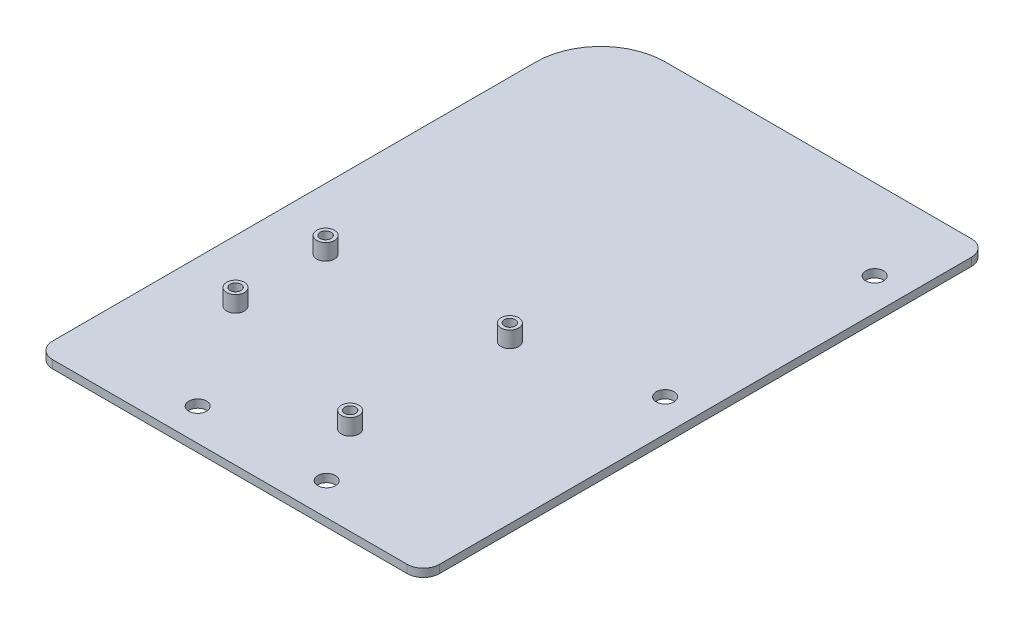
ISO-10303-21;
HEADER;
FILE_DESCRIPTION(('STEP AP214'),'2;1');
FILE_NAME('part.step','',(''),(''),'','','');
FILE_SCHEMA(('AUTOMOTIVE_DESIGN { 1 0 10303 214 1 1 1 1 }'));
ENDSEC;
DATA;
#1=APPLICATION_CONTEXT('core data for automotive mechanical design processes');
#2=APPLICATION_PROTOCOL_DEFINITION('international standard','automotive_design',2000,#1);
#3=PRODUCT_CONTEXT('',#1,'mechanical');
#4=PRODUCT('Part','Part','',(#3));
#5=PRODUCT_RELATED_PRODUCT_CATEGORY('part','',(#4));
#6=PRODUCT_DEFINITION_FORMATION('','',#4);
#7=PRODUCT_DEFINITION_CONTEXT('part definition',#1,'design');
#8=PRODUCT_DEFINITION('design','',#6,#7);
#9=PRODUCT_DEFINITION_SHAPE('','',#8);
#10=(LENGTH_UNIT() NAMED_UNIT(*) SI_UNIT(.MILLI.,.METRE.));
#11=(NAMED_UNIT(*) PLANE_ANGLE_UNIT() SI_UNIT($,.RADIAN.));
#12=(NAMED_UNIT(*) SI_UNIT($,.STERADIAN.) SOLID_ANGLE_UNIT());
#13=UNCERTAINTY_MEASURE_WITH_UNIT(LENGTH_MEASURE(1.E-05),#10,'distance_accuracy_value','');
#14=(GEOMETRIC_REPRESENTATION_CONTEXT(3) GLOBAL_UNCERTAINTY_ASSIGNED_CONTEXT((#13)) GLOBAL_UNIT_ASSIGNED_CONTEXT((#10,
#11,#12)) REPRESENTATION_CONTEXT('',''));
#15=CARTESIAN_POINT('',(0.,0.,0.));
#16=DIRECTION('',(0.,0.,1.));
#17=DIRECTION('',(1.,0.,0.));
#18=AXIS2_PLACEMENT_3D('',#15,#16,#17);
#19=CARTESIAN_POINT('',(0.,2.5,0.));
#20=DIRECTION('',(0.,-1.,0.));
#21=DIRECTION('',(0.,0.,-1.));
#22=AXIS2_PLACEMENT_3D('',#19,#20,#21);
#23=PLANE('',#22);
#24=CARTESIAN_POINT('',(11.03,2.5,11.7));
#25=DIRECTION('',(0.,-1.,0.));
#26=DIRECTION('',(0.,0.,-1.));
#27=AXIS2_PLACEMENT_3D('',#24,#25,#26);
#28=CIRCLE('',#27,2.75);
#29=CARTESIAN_POINT('',(11.03,2.5,8.94999999999998));
#30=VERTEX_POINT('',#29);
#31=EDGE_CURVE('E40',#30,#30,#28,.F.);
#32=ORIENTED_EDGE('',*,*,#31,.F.);
#33=EDGE_LOOP('',(#32));
#34=FACE_BOUND('',#33,.T.);
#35=CARTESIAN_POINT('',(-41.04,2.5,16.78));
#36=DIRECTION('',(0.,-1.,0.));
#37=DIRECTION('',(0.,0.,-1.));
#38=AXIS2_PLACEMENT_3D('',#35,#36,#37);
#39=CIRCLE('',#38,2.75);
#40=CARTESIAN_POINT('',(-41.04,2.5,14.03));
#41=VERTEX_POINT('',#40);
#42=EDGE_CURVE('E161',#41,#41,#39,.F.);
#43=ORIENTED_EDGE('',*,*,#42,.F.);
#44=EDGE_LOOP('',(#43));
#45=FACE_BOUND('',#44,.T.);
#46=CARTESIAN_POINT('',(50.,2.5,-62.5));
#47=DIRECTION('',(0.,1.,0.));
#48=DIRECTION('',(0.,0.,1.));
#49=AXIS2_PLACEMENT_3D('',#46,#47,#48);
#50=CIRCLE('',#49,2.74999999999999);
#51=CARTESIAN_POINT('',(50.,2.5,-59.75));
#52=VERTEX_POINT('',#51);
#53=EDGE_CURVE('E180',#52,#52,#50,.T.);
#54=ORIENTED_EDGE('',*,*,#53,.F.);
#55=EDGE_LOOP('',(#54));
#56=FACE_BOUND('',#55,.T.);
#57=CARTESIAN_POINT('',(50.,2.5,2.49999999999996));
#58=DIRECTION('',(0.,1.,0.));
#59=DIRECTION('',(0.,0.,1.));
#60=AXIS2_PLACEMENT_3D('',#57,#58,#59);
#61=CIRCLE('',#60,2.74999999999999);
#62=CARTESIAN_POINT('',(50.,2.5,5.24999999999995));
#63=VERTEX_POINT('',#62);
#64=EDGE_CURVE('E184',#63,#63,#61,.T.);
#65=ORIENTED_EDGE('',*,*,#64,.F.);
#66=EDGE_LOOP('',(#65));
#67=FACE_BOUND('',#66,.T.);
#68=CARTESIAN_POINT('',(-20.,2.5,77.5));
#69=DIRECTION('',(0.,1.,0.));
#70=DIRECTION('',(0.,0.,1.));
#71=AXIS2_PLACEMENT_3D('',#68,#69,#70);
#72=CIRCLE('',#71,2.74999999999999);
#73=CARTESIAN_POINT('',(-20.,2.5,80.25));
#74=VERTEX_POINT('',#73);
#75=EDGE_CURVE('E188',#74,#74,#72,.T.);
#76=ORIENTED_EDGE('',*,*,#75,.F.);
#77=EDGE_LOOP('',(#76));
#78=FACE_BOUND('',#77,.T.);
#79=CARTESIAN_POINT('',(20.,2.5,77.5));
#80=DIRECTION('',(0.,1.,0.));
#81=DIRECTION('',(0.,0.,1.));
#82=AXIS2_PLACEMENT_3D('',#79,#80,#81);
#83=CIRCLE('',#82,2.74999999999999);
#84=CARTESIAN_POINT('',(20.,2.5,80.25));
#85=VERTEX_POINT('',#84);
#86=EDGE_CURVE('E191',#85,#85,#83,.T.);
#87=ORIENTED_EDGE('',*,*,#86,.F.);
#88=EDGE_LOOP('',(#87));
#89=FACE_BOUND('',#88,.T.);
#90=DIRECTION('',(0.,0.,1.));
#91=VECTOR('',#90,1.);
#92=CARTESIAN_POINT('',(-60.,2.5,87.5));
#93=LINE('',#92,#91);
#94=CARTESIAN_POINT('',(-60.,2.5,-67.5));
#95=VERTEX_POINT('',#94);
#96=CARTESIAN_POINT('',(-60.,2.5,82.5));
#97=VERTEX_POINT('',#96);
#98=EDGE_CURVE('E118',#95,#97,#93,.T.);
#99=ORIENTED_EDGE('',*,*,#98,.T.);
#100=CARTESIAN_POINT('',(-55.,2.5,82.5));
#101=DIRECTION('',(0.,-1.,0.));
#102=DIRECTION('',(0.,0.,-1.));
#103=AXIS2_PLACEMENT_3D('',#100,#101,#102);
#104=CIRCLE('',#103,5.);
#105=CARTESIAN_POINT('',(-55.,2.5,87.5));
#106=VERTEX_POINT('',#105);
#107=EDGE_CURVE('E152',#97,#106,#104,.F.);
#108=ORIENTED_EDGE('',*,*,#107,.T.);
#109=DIRECTION('',(1.,0.,0.));
#110=VECTOR('',#109,1.);
#111=CARTESIAN_POINT('',(-60.,2.5,87.5));
#112=LINE('',#111,#110);
#113=CARTESIAN_POINT('',(55.,2.5,87.5));
#114=VERTEX_POINT('',#113);
#115=EDGE_CURVE('E119',#106,#114,#112,.T.);
#116=ORIENTED_EDGE('',*,*,#115,.T.);
#117=CARTESIAN_POINT('',(55.,2.5,82.5));
#118=DIRECTION('',(0.,-1.,0.));
#119=DIRECTION('',(0.,0.,-1.));
#120=AXIS2_PLACEMENT_3D('',#117,#118,#119);
#121=CIRCLE('',#120,5.);
#122=CARTESIAN_POINT('',(60.,2.5,82.5));
#123=VERTEX_POINT('',#122);
#124=EDGE_CURVE('E54',#114,#123,#121,.F.);
#125=ORIENTED_EDGE('',*,*,#124,.T.);
#126=DIRECTION('',(0.,0.,-1.));
#127=VECTOR('',#126,1.);
#128=CARTESIAN_POINT('',(60.,2.5,87.5));
#129=LINE('',#128,#127);
#130=CARTESIAN_POINT('',(60.,2.5,-82.5));
#131=VERTEX_POINT('',#130);
#132=EDGE_CURVE('E128',#123,#131,#129,.T.);
#133=ORIENTED_EDGE('',*,*,#132,.T.);
#134=CARTESIAN_POINT('',(55.,2.5,-82.5));
#135=DIRECTION('',(0.,-1.,0.));
#136=DIRECTION('',(0.,0.,-1.));
#137=AXIS2_PLACEMENT_3D('',#134,#135,#136);
#138=CIRCLE('',#137,5.);
#139=CARTESIAN_POINT('',(55.,2.5,-87.5));
#140=VERTEX_POINT('',#139);
#141=EDGE_CURVE('E149',#131,#140,#138,.F.);
#142=ORIENTED_EDGE('',*,*,#141,.T.);
#143=DIRECTION('',(-1.,0.,0.));
#144=VECTOR('',#143,1.);
#145=CARTESIAN_POINT('',(-60.,2.5,-87.5));
#146=LINE('',#145,#144);
#147=CARTESIAN_POINT('',(-40.,2.5,-87.5));
#148=VERTEX_POINT('',#147);
#149=EDGE_CURVE('E301',#140,#148,#146,.T.);
#150=ORIENTED_EDGE('',*,*,#149,.T.);
#151=CARTESIAN_POINT('',(-40.,2.5,-67.5));
#152=DIRECTION('',(0.,-1.,0.));
#153=DIRECTION('',(0.,0.,-1.));
#154=AXIS2_PLACEMENT_3D('',#151,#152,#153);
#155=CIRCLE('',#154,20.);
#156=EDGE_CURVE('E135',#148,#95,#155,.F.);
#157=ORIENTED_EDGE('',*,*,#156,.T.);
#158=EDGE_LOOP('',(#99,#108,#116,#125,#133,#142,#150,#157));
#159=FACE_BOUND('',#158,.T.);
#160=CARTESIAN_POINT('',(9.76000000000003,2.5,59.96));
#161=DIRECTION('',(0.,-1.,0.));
#162=DIRECTION('',(0.,0.,-1.));
#163=AXIS2_PLACEMENT_3D('',#160,#161,#162);
#164=CIRCLE('',#163,2.75);
#165=CARTESIAN_POINT('',(9.76000000000003,2.5,57.21));
#166=VERTEX_POINT('',#165);
#167=EDGE_CURVE('E164',#166,#166,#164,.F.);
#168=ORIENTED_EDGE('',*,*,#167,.F.);
#169=EDGE_LOOP('',(#168));
#170=FACE_BOUND('',#169,.T.);
#171=CARTESIAN_POINT('',(-41.04,2.5,44.72));
#172=DIRECTION('',(0.,-1.,0.));
#173=DIRECTION('',(0.,0.,-1.));
#174=AXIS2_PLACEMENT_3D('',#171,#172,#173);
#175=CIRCLE('',#174,2.75);
#176=CARTESIAN_POINT('',(-41.04,2.5,41.97));
#177=VERTEX_POINT('',#176);
#178=EDGE_CURVE('E11',#177,#177,#175,.F.);
#179=ORIENTED_EDGE('',*,*,#178,.F.);
#180=EDGE_LOOP('',(#179));
#181=FACE_BOUND('',#180,.T.);
#182=ADVANCED_FACE('F32',(#34,#45,#56,#67,#78,#89,#159,#170,#181),#23,.F.);
#183=CARTESIAN_POINT('',(60.,2.5,87.5));
#184=DIRECTION('',(-1.,0.,0.));
#185=DIRECTION('',(0.,0.,1.));
#186=AXIS2_PLACEMENT_3D('',#183,#184,#185);
#187=PLANE('',#186);
#188=ORIENTED_EDGE('',*,*,#132,.F.);
#189=DIRECTION('',(0.,-1.,0.));
#190=VECTOR('',#189,1.);
#191=CARTESIAN_POINT('',(60.,2.5,82.5));
#192=LINE('',#191,#190);
#193=CARTESIAN_POINT('',(60.,0.,82.5));
#194=VERTEX_POINT('',#193);
#195=EDGE_CURVE('E155',#123,#194,#192,.T.);
#196=ORIENTED_EDGE('',*,*,#195,.T.);
#197=DIRECTION('',(0.,0.,-1.));
#198=VECTOR('',#197,1.);
#199=CARTESIAN_POINT('',(60.,0.,87.5));
#200=LINE('',#199,#198);
#201=CARTESIAN_POINT('',(60.,0.,-82.5));
#202=VERTEX_POINT('',#201);
#203=EDGE_CURVE('E130',#194,#202,#200,.T.);
#204=ORIENTED_EDGE('',*,*,#203,.T.);
#205=DIRECTION('',(0.,-1.,0.));
#206=VECTOR('',#205,1.);
#207=CARTESIAN_POINT('',(60.,2.5,-82.5));
#208=LINE('',#207,#206);
#209=EDGE_CURVE('E47',#202,#131,#208,.F.);
#210=ORIENTED_EDGE('',*,*,#209,.T.);
#211=EDGE_LOOP('',(#188,#196,#204,#210));
#212=FACE_BOUND('',#211,.T.);
#213=ADVANCED_FACE('F173',(#212),#187,.F.);
#214=CARTESIAN_POINT('',(-60.,2.5,-87.5));
#215=DIRECTION('',(0.,0.,1.));
#216=DIRECTION('',(1.,0.,0.));
#217=AXIS2_PLACEMENT_3D('',#214,#215,#216);
#218=PLANE('',#217);
#219=ORIENTED_EDGE('',*,*,#149,.F.);
#220=DIRECTION('',(0.,-1.,0.));
#221=VECTOR('',#220,1.);
#222=CARTESIAN_POINT('',(55.,2.5,-87.5));
#223=LINE('',#222,#221);
#224=CARTESIAN_POINT('',(55.,0.,-87.5));
#225=VERTEX_POINT('',#224);
#226=EDGE_CURVE('E158',#140,#225,#223,.T.);
#227=ORIENTED_EDGE('',*,*,#226,.T.);
#228=DIRECTION('',(-1.,0.,0.));
#229=VECTOR('',#228,1.);
#230=CARTESIAN_POINT('',(-60.,0.,-87.5));
#231=LINE('',#230,#229);
#232=CARTESIAN_POINT('',(-40.,0.,-87.5));
#233=VERTEX_POINT('',#232);
#234=EDGE_CURVE('E125',#225,#233,#231,.T.);
#235=ORIENTED_EDGE('',*,*,#234,.T.);
#236=DIRECTION('',(0.,-1.,0.));
#237=VECTOR('',#236,1.);
#238=CARTESIAN_POINT('',(-40.,2.5,-87.5));
#239=LINE('',#238,#237);
#240=EDGE_CURVE('E106',#233,#148,#239,.F.);
#241=ORIENTED_EDGE('',*,*,#240,.T.);
#242=EDGE_LOOP('',(#219,#227,#235,#241));
#243=FACE_BOUND('',#242,.T.);
#244=ADVANCED_FACE('F274',(#243),#218,.F.);
#245=CARTESIAN_POINT('',(-60.,2.5,87.5));
#246=DIRECTION('',(1.,0.,0.));
#247=DIRECTION('',(0.,0.,-1.));
#248=AXIS2_PLACEMENT_3D('',#245,#246,#247);
#249=PLANE('',#248);
#250=DIRECTION('',(0.,0.,1.));
#251=VECTOR('',#250,1.);
#252=CARTESIAN_POINT('',(-60.,0.,87.5));
#253=LINE('',#252,#251);
#254=CARTESIAN_POINT('',(-60.,0.,-67.5));
#255=VERTEX_POINT('',#254);
#256=CARTESIAN_POINT('',(-60.,0.,82.5));
#257=VERTEX_POINT('',#256);
#258=EDGE_CURVE('E115',#255,#257,#253,.T.);
#259=ORIENTED_EDGE('',*,*,#258,.T.);
#260=DIRECTION('',(0.,-1.,0.));
#261=VECTOR('',#260,1.);
#262=CARTESIAN_POINT('',(-60.,2.5,82.5));
#263=LINE('',#262,#261);
#264=EDGE_CURVE('E147',#257,#97,#263,.F.);
#265=ORIENTED_EDGE('',*,*,#264,.T.);
#266=ORIENTED_EDGE('',*,*,#98,.F.);
#267=DIRECTION('',(0.,-1.,0.));
#268=VECTOR('',#267,1.);
#269=CARTESIAN_POINT('',(-60.,2.5,-67.5));
#270=LINE('',#269,#268);
#271=EDGE_CURVE('E104',#95,#255,#270,.T.);
#272=ORIENTED_EDGE('',*,*,#271,.T.);
#273=EDGE_LOOP('',(#259,#265,#266,#272));
#274=FACE_BOUND('',#273,.T.);
#275=ADVANCED_FACE('F114',(#274),#249,.F.);
#276=CARTESIAN_POINT('',(-60.,2.5,87.5));
#277=DIRECTION('',(0.,0.,-1.));
#278=DIRECTION('',(-1.,0.,0.));
#279=AXIS2_PLACEMENT_3D('',#276,#277,#278);
#280=PLANE('',#279);
#281=ORIENTED_EDGE('',*,*,#115,.F.);
#282=DIRECTION('',(0.,-1.,0.));
#283=VECTOR('',#282,1.);
#284=CARTESIAN_POINT('',(-55.,2.5,87.5));
#285=LINE('',#284,#283);
#286=CARTESIAN_POINT('',(-55.,0.,87.5));
#287=VERTEX_POINT('',#286);
#288=EDGE_CURVE('E139',#106,#287,#285,.T.);
#289=ORIENTED_EDGE('',*,*,#288,.T.);
#290=DIRECTION('',(1.,0.,0.));
#291=VECTOR('',#290,1.);
#292=CARTESIAN_POINT('',(-60.,0.,87.5));
#293=LINE('',#292,#291);
#294=CARTESIAN_POINT('',(55.,0.,87.5));
#295=VERTEX_POINT('',#294);
#296=EDGE_CURVE('E124',#287,#295,#293,.T.);
#297=ORIENTED_EDGE('',*,*,#296,.T.);
#298=DIRECTION('',(0.,-1.,0.));
#299=VECTOR('',#298,1.);
#300=CARTESIAN_POINT('',(55.,2.5,87.5));
#301=LINE('',#300,#299);
#302=EDGE_CURVE('E137',#295,#114,#301,.F.);
#303=ORIENTED_EDGE('',*,*,#302,.T.);
#304=EDGE_LOOP('',(#281,#289,#297,#303));
#305=FACE_BOUND('',#304,.T.);
#306=ADVANCED_FACE('F267',(#305),#280,.F.);
#307=CARTESIAN_POINT('',(0.,0.,0.));
#308=DIRECTION('',(0.,-1.,0.));
#309=DIRECTION('',(0.,0.,-1.));
#310=AXIS2_PLACEMENT_3D('',#307,#308,#309);
#311=PLANE('',#310);
#312=CARTESIAN_POINT('',(9.76000000000003,0.,59.96));
#313=DIRECTION('',(0.,1.,0.));
#314=DIRECTION('',(0.,0.,1.));
#315=AXIS2_PLACEMENT_3D('',#312,#313,#314);
#316=CIRCLE('',#315,1.69999999999999);
#317=CARTESIAN_POINT('',(9.76000000000003,0.,61.66));
#318=VERTEX_POINT('',#317);
#319=EDGE_CURVE('E326',#318,#318,#316,.T.);
#320=ORIENTED_EDGE('',*,*,#319,.T.);
#321=EDGE_LOOP('',(#320));
#322=FACE_BOUND('',#321,.T.);
#323=CARTESIAN_POINT('',(11.03,0.,11.7));
#324=DIRECTION('',(0.,1.,0.));
#325=DIRECTION('',(0.,0.,1.));
#326=AXIS2_PLACEMENT_3D('',#323,#324,#325);
#327=CIRCLE('',#326,1.69999999999999);
#328=CARTESIAN_POINT('',(11.03,0.,13.4));
#329=VERTEX_POINT('',#328);
#330=EDGE_CURVE('E323',#329,#329,#327,.T.);
#331=ORIENTED_EDGE('',*,*,#330,.T.);
#332=EDGE_LOOP('',(#331));
#333=FACE_BOUND('',#332,.T.);
#334=CARTESIAN_POINT('',(-41.04,0.,44.72));
#335=DIRECTION('',(0.,1.,0.));
#336=DIRECTION('',(0.,0.,1.));
#337=AXIS2_PLACEMENT_3D('',#334,#335,#336);
#338=CIRCLE('',#337,1.69999999999999);
#339=CARTESIAN_POINT('',(-41.04,0.,46.42));
#340=VERTEX_POINT('',#339);
#341=EDGE_CURVE('E320',#340,#340,#338,.T.);
#342=ORIENTED_EDGE('',*,*,#341,.T.);
#343=EDGE_LOOP('',(#342));
#344=FACE_BOUND('',#343,.T.);
#345=CARTESIAN_POINT('',(-41.04,0.,16.78));
#346=DIRECTION('',(0.,1.,0.));
#347=DIRECTION('',(0.,0.,1.));
#348=AXIS2_PLACEMENT_3D('',#345,#346,#347);
#349=CIRCLE('',#348,1.69999999999999);
#350=CARTESIAN_POINT('',(-41.04,0.,18.48));
#351=VERTEX_POINT('',#350);
#352=EDGE_CURVE('E317',#351,#351,#349,.T.);
#353=ORIENTED_EDGE('',*,*,#352,.T.);
#354=EDGE_LOOP('',(#353));
#355=FACE_BOUND('',#354,.T.);
#356=CARTESIAN_POINT('',(50.,0.,-62.5));
#357=DIRECTION('',(0.,1.,0.));
#358=DIRECTION('',(0.,0.,1.));
#359=AXIS2_PLACEMENT_3D('',#356,#357,#358);
#360=CIRCLE('',#359,2.75);
#361=CARTESIAN_POINT('',(50.,0.,-59.75));
#362=VERTEX_POINT('',#361);
#363=EDGE_CURVE('E313',#362,#362,#360,.T.);
#364=ORIENTED_EDGE('',*,*,#363,.T.);
#365=EDGE_LOOP('',(#364));
#366=FACE_BOUND('',#365,.T.);
#367=CARTESIAN_POINT('',(50.,0.,2.49999999999996));
#368=DIRECTION('',(0.,1.,0.));
#369=DIRECTION('',(0.,0.,1.));
#370=AXIS2_PLACEMENT_3D('',#367,#368,#369);
#371=CIRCLE('',#370,2.75);
#372=CARTESIAN_POINT('',(50.,0.,5.24999999999996));
#373=VERTEX_POINT('',#372);
#374=EDGE_CURVE('E309',#373,#373,#371,.T.);
#375=ORIENTED_EDGE('',*,*,#374,.T.);
#376=EDGE_LOOP('',(#375));
#377=FACE_BOUND('',#376,.T.);
#378=CARTESIAN_POINT('',(-20.,0.,77.5));
#379=DIRECTION('',(0.,1.,0.));
#380=DIRECTION('',(0.,0.,1.));
#381=AXIS2_PLACEMENT_3D('',#378,#379,#380);
#382=CIRCLE('',#381,2.74999999999999);
#383=CARTESIAN_POINT('',(-20.,0.,80.25));
#384=VERTEX_POINT('',#383);
#385=EDGE_CURVE('E305',#384,#384,#382,.T.);
#386=ORIENTED_EDGE('',*,*,#385,.T.);
#387=EDGE_LOOP('',(#386));
#388=FACE_BOUND('',#387,.T.);
#389=CARTESIAN_POINT('',(20.,0.,77.5));
#390=DIRECTION('',(0.,1.,0.));
#391=DIRECTION('',(0.,0.,1.));
#392=AXIS2_PLACEMENT_3D('',#389,#390,#391);
#393=CIRCLE('',#392,2.74999999999999);
#394=CARTESIAN_POINT('',(20.,0.,80.25));
#395=VERTEX_POINT('',#394);
#396=EDGE_CURVE('E295',#395,#395,#393,.T.);
#397=ORIENTED_EDGE('',*,*,#396,.T.);
#398=EDGE_LOOP('',(#397));
#399=FACE_BOUND('',#398,.T.);
#400=ORIENTED_EDGE('',*,*,#296,.F.);
#401=CARTESIAN_POINT('',(-55.,0.,82.5));
#402=DIRECTION('',(0.,-1.,0.));
#403=DIRECTION('',(0.,0.,-1.));
#404=AXIS2_PLACEMENT_3D('',#401,#402,#403);
#405=CIRCLE('',#404,5.);
#406=EDGE_CURVE('E123',#287,#257,#405,.T.);
#407=ORIENTED_EDGE('',*,*,#406,.T.);
#408=ORIENTED_EDGE('',*,*,#258,.F.);
#409=CARTESIAN_POINT('',(-40.,0.,-67.5));
#410=DIRECTION('',(0.,-1.,0.));
#411=DIRECTION('',(0.,0.,-1.));
#412=AXIS2_PLACEMENT_3D('',#409,#410,#411);
#413=CIRCLE('',#412,20.);
#414=EDGE_CURVE('E100',#255,#233,#413,.T.);
#415=ORIENTED_EDGE('',*,*,#414,.T.);
#416=ORIENTED_EDGE('',*,*,#234,.F.);
#417=CARTESIAN_POINT('',(55.,0.,-82.5));
#418=DIRECTION('',(0.,-1.,0.));
#419=DIRECTION('',(0.,0.,-1.));
#420=AXIS2_PLACEMENT_3D('',#417,#418,#419);
#421=CIRCLE('',#420,5.);
#422=EDGE_CURVE('E142',#225,#202,#421,.T.);
#423=ORIENTED_EDGE('',*,*,#422,.T.);
#424=ORIENTED_EDGE('',*,*,#203,.F.);
#425=CARTESIAN_POINT('',(55.,0.,82.5));
#426=DIRECTION('',(0.,-1.,0.));
#427=DIRECTION('',(0.,0.,-1.));
#428=AXIS2_PLACEMENT_3D('',#425,#426,#427);
#429=CIRCLE('',#428,5.);
#430=EDGE_CURVE('E144',#194,#295,#429,.T.);
#431=ORIENTED_EDGE('',*,*,#430,.T.);
#432=EDGE_LOOP('',(#400,#407,#408,#415,#416,#423,#424,#431));
#433=FACE_BOUND('',#432,.T.);
#434=ADVANCED_FACE('F122',(#322,#333,#344,#355,#366,#377,#388,#399,#433),#311,.T.);
#435=CARTESIAN_POINT('',(20.,2.5,77.5));
#436=DIRECTION('',(0.,1.,0.));
#437=DIRECTION('',(0.,0.,1.));
#438=AXIS2_PLACEMENT_3D('',#435,#436,#437);
#439=CYLINDRICAL_SURFACE('',#438,2.74999999999999);
#440=ORIENTED_EDGE('',*,*,#396,.F.);
#441=EDGE_LOOP('',(#440));
#442=FACE_BOUND('',#441,.T.);
#443=ORIENTED_EDGE('',*,*,#86,.T.);
#444=EDGE_LOOP('',(#443));
#445=FACE_BOUND('',#444,.T.);
#446=ADVANCED_FACE('F260',(#442,#445),#439,.F.);
#447=CARTESIAN_POINT('',(-20.,2.5,77.5));
#448=DIRECTION('',(0.,1.,0.));
#449=DIRECTION('',(0.,0.,1.));
#450=AXIS2_PLACEMENT_3D('',#447,#448,#449);
#451=CYLINDRICAL_SURFACE('',#450,2.74999999999999);
#452=ORIENTED_EDGE('',*,*,#385,.F.);
#453=EDGE_LOOP('',(#452));
#454=FACE_BOUND('',#453,.T.);
#455=ORIENTED_EDGE('',*,*,#75,.T.);
#456=EDGE_LOOP('',(#455));
#457=FACE_BOUND('',#456,.T.);
#458=ADVANCED_FACE('F256',(#454,#457),#451,.F.);
#459=CARTESIAN_POINT('',(50.,2.5,2.49999999999996));
#460=DIRECTION('',(0.,1.,0.));
#461=DIRECTION('',(0.,0.,1.));
#462=AXIS2_PLACEMENT_3D('',#459,#460,#461);
#463=CYLINDRICAL_SURFACE('',#462,2.74999999999999);
#464=ORIENTED_EDGE('',*,*,#374,.F.);
#465=EDGE_LOOP('',(#464));
#466=FACE_BOUND('',#465,.T.);
#467=ORIENTED_EDGE('',*,*,#64,.T.);
#468=EDGE_LOOP('',(#467));
#469=FACE_BOUND('',#468,.T.);
#470=ADVANCED_FACE('F252',(#466,#469),#463,.F.);
#471=CARTESIAN_POINT('',(50.,2.5,-62.5));
#472=DIRECTION('',(0.,1.,0.));
#473=DIRECTION('',(0.,0.,1.));
#474=AXIS2_PLACEMENT_3D('',#471,#472,#473);
#475=CYLINDRICAL_SURFACE('',#474,2.74999999999999);
#476=ORIENTED_EDGE('',*,*,#363,.F.);
#477=EDGE_LOOP('',(#476));
#478=FACE_BOUND('',#477,.T.);
#479=ORIENTED_EDGE('',*,*,#53,.T.);
#480=EDGE_LOOP('',(#479));
#481=FACE_BOUND('',#480,.T.);
#482=ADVANCED_FACE('F248',(#478,#481),#475,.F.);
#483=CARTESIAN_POINT('',(-41.04,2.5,16.78));
#484=DIRECTION('',(0.,1.,0.));
#485=DIRECTION('',(0.,0.,1.));
#486=AXIS2_PLACEMENT_3D('',#483,#484,#485);
#487=CYLINDRICAL_SURFACE('',#486,1.69999999999999);
#488=CARTESIAN_POINT('',(-41.04,7.5,16.78));
#489=DIRECTION('',(0.,1.,0.));
#490=DIRECTION('',(0.,0.,1.));
#491=AXIS2_PLACEMENT_3D('',#488,#489,#490);
#492=CIRCLE('',#491,1.69999999999999);
#493=CARTESIAN_POINT('',(-41.04,7.5,18.48));
#494=VERTEX_POINT('',#493);
#495=EDGE_CURVE('E332',#494,#494,#492,.T.);
#496=ORIENTED_EDGE('',*,*,#495,.T.);
#497=EDGE_LOOP('',(#496));
#498=FACE_BOUND('',#497,.T.);
#499=ORIENTED_EDGE('',*,*,#352,.F.);
#500=EDGE_LOOP('',(#499));
#501=FACE_BOUND('',#500,.T.);
#502=ADVANCED_FACE('F244',(#498,#501),#487,.F.);
#503=CARTESIAN_POINT('',(-41.04,2.5,44.72));
#504=DIRECTION('',(0.,1.,0.));
#505=DIRECTION('',(0.,0.,1.));
#506=AXIS2_PLACEMENT_3D('',#503,#504,#505);
#507=CYLINDRICAL_SURFACE('',#506,1.69999999999999);
#508=ORIENTED_EDGE('',*,*,#341,.F.);
#509=EDGE_LOOP('',(#508));
#510=FACE_BOUND('',#509,.T.);
#511=CARTESIAN_POINT('',(-41.04,7.5,44.72));
#512=DIRECTION('',(0.,1.,0.));
#513=DIRECTION('',(0.,0.,1.));
#514=AXIS2_PLACEMENT_3D('',#511,#512,#513);
#515=CIRCLE('',#514,1.69999999999999);
#516=CARTESIAN_POINT('',(-41.04,7.5,46.42));
#517=VERTEX_POINT('',#516);
#518=EDGE_CURVE('E350',#517,#517,#515,.T.);
#519=ORIENTED_EDGE('',*,*,#518,.T.);
#520=EDGE_LOOP('',(#519));
#521=FACE_BOUND('',#520,.T.);
#522=ADVANCED_FACE('F240',(#510,#521),#507,.F.);
#523=CARTESIAN_POINT('',(11.03,2.5,11.7));
#524=DIRECTION('',(0.,1.,0.));
#525=DIRECTION('',(0.,0.,1.));
#526=AXIS2_PLACEMENT_3D('',#523,#524,#525);
#527=CYLINDRICAL_SURFACE('',#526,1.69999999999999);
#528=ORIENTED_EDGE('',*,*,#330,.F.);
#529=EDGE_LOOP('',(#528));
#530=FACE_BOUND('',#529,.T.);
#531=CARTESIAN_POINT('',(11.03,7.5,11.7));
#532=DIRECTION('',(0.,1.,0.));
#533=DIRECTION('',(0.,0.,1.));
#534=AXIS2_PLACEMENT_3D('',#531,#532,#533);
#535=CIRCLE('',#534,1.69999999999999);
#536=CARTESIAN_POINT('',(11.03,7.5,13.4));
#537=VERTEX_POINT('',#536);
#538=EDGE_CURVE('E344',#537,#537,#535,.T.);
#539=ORIENTED_EDGE('',*,*,#538,.T.);
#540=EDGE_LOOP('',(#539));
#541=FACE_BOUND('',#540,.T.);
#542=ADVANCED_FACE('F236',(#530,#541),#527,.F.);
#543=CARTESIAN_POINT('',(9.76000000000003,2.5,59.96));
#544=DIRECTION('',(0.,1.,0.));
#545=DIRECTION('',(0.,0.,1.));
#546=AXIS2_PLACEMENT_3D('',#543,#544,#545);
#547=CYLINDRICAL_SURFACE('',#546,1.69999999999999);
#548=ORIENTED_EDGE('',*,*,#319,.F.);
#549=EDGE_LOOP('',(#548));
#550=FACE_BOUND('',#549,.T.);
#551=CARTESIAN_POINT('',(9.76000000000003,7.5,59.96));
#552=DIRECTION('',(0.,1.,0.));
#553=DIRECTION('',(0.,0.,1.));
#554=AXIS2_PLACEMENT_3D('',#551,#552,#553);
#555=CIRCLE('',#554,1.69999999999999);
#556=CARTESIAN_POINT('',(9.76000000000003,7.5,61.66));
#557=VERTEX_POINT('',#556);
#558=EDGE_CURVE('E338',#557,#557,#555,.T.);
#559=ORIENTED_EDGE('',*,*,#558,.T.);
#560=EDGE_LOOP('',(#559));
#561=FACE_BOUND('',#560,.T.);
#562=ADVANCED_FACE('F233',(#550,#561),#547,.F.);
#563=CARTESIAN_POINT('',(-40.,2.5,-67.5));
#564=DIRECTION('',(0.,-1.,0.));
#565=DIRECTION('',(0.,0.,-1.));
#566=AXIS2_PLACEMENT_3D('',#563,#564,#565);
#567=CYLINDRICAL_SURFACE('',#566,20.);
#568=ORIENTED_EDGE('',*,*,#156,.F.);
#569=ORIENTED_EDGE('',*,*,#240,.F.);
#570=ORIENTED_EDGE('',*,*,#414,.F.);
#571=ORIENTED_EDGE('',*,*,#271,.F.);
#572=EDGE_LOOP('',(#568,#569,#570,#571));
#573=FACE_BOUND('',#572,.T.);
#574=ADVANCED_FACE('F103',(#573),#567,.T.);
#575=CARTESIAN_POINT('',(-55.,2.5,82.5));
#576=DIRECTION('',(0.,-1.,0.));
#577=DIRECTION('',(0.,0.,-1.));
#578=AXIS2_PLACEMENT_3D('',#575,#576,#577);
#579=CYLINDRICAL_SURFACE('',#578,5.);
#580=ORIENTED_EDGE('',*,*,#107,.F.);
#581=ORIENTED_EDGE('',*,*,#264,.F.);
#582=ORIENTED_EDGE('',*,*,#406,.F.);
#583=ORIENTED_EDGE('',*,*,#288,.F.);
#584=EDGE_LOOP('',(#580,#581,#582,#583));
#585=FACE_BOUND('',#584,.T.);
#586=ADVANCED_FACE('F282',(#585),#579,.T.);
#587=CARTESIAN_POINT('',(55.,2.5,82.5));
#588=DIRECTION('',(0.,-1.,0.));
#589=DIRECTION('',(0.,0.,-1.));
#590=AXIS2_PLACEMENT_3D('',#587,#588,#589);
#591=CYLINDRICAL_SURFACE('',#590,5.);
#592=ORIENTED_EDGE('',*,*,#124,.F.);
#593=ORIENTED_EDGE('',*,*,#302,.F.);
#594=ORIENTED_EDGE('',*,*,#430,.F.);
#595=ORIENTED_EDGE('',*,*,#195,.F.);
#596=EDGE_LOOP('',(#592,#593,#594,#595));
#597=FACE_BOUND('',#596,.T.);
#598=ADVANCED_FACE('F284',(#597),#591,.T.);
#599=CARTESIAN_POINT('',(55.,2.5,-82.5));
#600=DIRECTION('',(0.,-1.,0.));
#601=DIRECTION('',(0.,0.,-1.));
#602=AXIS2_PLACEMENT_3D('',#599,#600,#601);
#603=CYLINDRICAL_SURFACE('',#602,5.);
#604=ORIENTED_EDGE('',*,*,#141,.F.);
#605=ORIENTED_EDGE('',*,*,#209,.F.);
#606=ORIENTED_EDGE('',*,*,#422,.F.);
#607=ORIENTED_EDGE('',*,*,#226,.F.);
#608=EDGE_LOOP('',(#604,#605,#606,#607));
#609=FACE_BOUND('',#608,.T.);
#610=ADVANCED_FACE('F34',(#609),#603,.T.);
#611=CARTESIAN_POINT('',(-41.04,7.5,16.78));
#612=DIRECTION('',(0.,1.,0.));
#613=DIRECTION('',(0.,0.,1.));
#614=AXIS2_PLACEMENT_3D('',#611,#612,#613);
#615=PLANE('',#614);
#616=CARTESIAN_POINT('',(-41.04,7.5,16.78));
#617=DIRECTION('',(0.,1.,0.));
#618=DIRECTION('',(0.,0.,1.));
#619=AXIS2_PLACEMENT_3D('',#616,#617,#618);
#620=CIRCLE('',#619,2.75);
#621=CARTESIAN_POINT('',(-41.04,7.5,19.53));
#622=VERTEX_POINT('',#621);
#623=EDGE_CURVE('E329',#622,#622,#620,.T.);
#624=ORIENTED_EDGE('',*,*,#623,.T.);
#625=EDGE_LOOP('',(#624));
#626=FACE_BOUND('',#625,.T.);
#627=ORIENTED_EDGE('',*,*,#495,.F.);
#628=EDGE_LOOP('',(#627));
#629=FACE_BOUND('',#628,.T.);
#630=ADVANCED_FACE('F226',(#626,#629),#615,.T.);
#631=CARTESIAN_POINT('',(-41.04,7.5,16.78));
#632=DIRECTION('',(0.,-1.,0.));
#633=DIRECTION('',(0.,0.,-1.));
#634=AXIS2_PLACEMENT_3D('',#631,#632,#633);
#635=CYLINDRICAL_SURFACE('',#634,2.75);
#636=ORIENTED_EDGE('',*,*,#623,.F.);
#637=EDGE_LOOP('',(#636));
#638=FACE_BOUND('',#637,.T.);
#639=ORIENTED_EDGE('',*,*,#42,.T.);
#640=EDGE_LOOP('',(#639));
#641=FACE_BOUND('',#640,.T.);
#642=ADVANCED_FACE('F221',(#638,#641),#635,.T.);
#643=CARTESIAN_POINT('',(9.76000000000003,7.5,59.96));
#644=DIRECTION('',(0.,1.,0.));
#645=DIRECTION('',(0.,0.,1.));
#646=AXIS2_PLACEMENT_3D('',#643,#644,#645);
#647=PLANE('',#646);
#648=CARTESIAN_POINT('',(9.76000000000003,7.5,59.96));
#649=DIRECTION('',(0.,1.,0.));
#650=DIRECTION('',(0.,0.,1.));
#651=AXIS2_PLACEMENT_3D('',#648,#649,#650);
#652=CIRCLE('',#651,2.75);
#653=CARTESIAN_POINT('',(9.76000000000003,7.5,62.71));
#654=VERTEX_POINT('',#653);
#655=EDGE_CURVE('E335',#654,#654,#652,.T.);
#656=ORIENTED_EDGE('',*,*,#655,.T.);
#657=EDGE_LOOP('',(#656));
#658=FACE_BOUND('',#657,.T.);
#659=ORIENTED_EDGE('',*,*,#558,.F.);
#660=EDGE_LOOP('',(#659));
#661=FACE_BOUND('',#660,.T.);
#662=ADVANCED_FACE('F218',(#658,#661),#647,.T.);
#663=CARTESIAN_POINT('',(9.76000000000003,7.5,59.96));
#664=DIRECTION('',(0.,-1.,0.));
#665=DIRECTION('',(0.,0.,-1.));
#666=AXIS2_PLACEMENT_3D('',#663,#664,#665);
#667=CYLINDRICAL_SURFACE('',#666,2.75);
#668=ORIENTED_EDGE('',*,*,#655,.F.);
#669=EDGE_LOOP('',(#668));
#670=FACE_BOUND('',#669,.T.);
#671=ORIENTED_EDGE('',*,*,#167,.T.);
#672=EDGE_LOOP('',(#671));
#673=FACE_BOUND('',#672,.T.);
#674=ADVANCED_FACE('F213',(#670,#673),#667,.T.);
#675=CARTESIAN_POINT('',(11.03,7.5,11.7));
#676=DIRECTION('',(0.,1.,0.));
#677=DIRECTION('',(0.,0.,1.));
#678=AXIS2_PLACEMENT_3D('',#675,#676,#677);
#679=PLANE('',#678);
#680=CARTESIAN_POINT('',(11.03,7.5,11.7));
#681=DIRECTION('',(0.,1.,0.));
#682=DIRECTION('',(0.,0.,1.));
#683=AXIS2_PLACEMENT_3D('',#680,#681,#682);
#684=CIRCLE('',#683,2.75);
#685=CARTESIAN_POINT('',(11.03,7.5,14.45));
#686=VERTEX_POINT('',#685);
#687=EDGE_CURVE('E341',#686,#686,#684,.T.);
#688=ORIENTED_EDGE('',*,*,#687,.T.);
#689=EDGE_LOOP('',(#688));
#690=FACE_BOUND('',#689,.T.);
#691=ORIENTED_EDGE('',*,*,#538,.F.);
#692=EDGE_LOOP('',(#691));
#693=FACE_BOUND('',#692,.T.);
#694=ADVANCED_FACE('F210',(#690,#693),#679,.T.);
#695=CARTESIAN_POINT('',(11.03,7.5,11.7));
#696=DIRECTION('',(0.,-1.,0.));
#697=DIRECTION('',(0.,0.,-1.));
#698=AXIS2_PLACEMENT_3D('',#695,#696,#697);
#699=CYLINDRICAL_SURFACE('',#698,2.75);
#700=ORIENTED_EDGE('',*,*,#687,.F.);
#701=EDGE_LOOP('',(#700));
#702=FACE_BOUND('',#701,.T.);
#703=ORIENTED_EDGE('',*,*,#31,.T.);
#704=EDGE_LOOP('',(#703));
#705=FACE_BOUND('',#704,.T.);
#706=ADVANCED_FACE('F169',(#702,#705),#699,.T.);
#707=CARTESIAN_POINT('',(-41.04,7.5,44.72));
#708=DIRECTION('',(0.,1.,0.));
#709=DIRECTION('',(0.,0.,1.));
#710=AXIS2_PLACEMENT_3D('',#707,#708,#709);
#711=PLANE('',#710);
#712=CARTESIAN_POINT('',(-41.04,7.5,44.72));
#713=DIRECTION('',(0.,1.,0.));
#714=DIRECTION('',(0.,0.,1.));
#715=AXIS2_PLACEMENT_3D('',#712,#713,#714);
#716=CIRCLE('',#715,2.75);
#717=CARTESIAN_POINT('',(-41.04,7.5,47.47));
#718=VERTEX_POINT('',#717);
#719=EDGE_CURVE('E347',#718,#718,#716,.T.);
#720=ORIENTED_EDGE('',*,*,#719,.T.);
#721=EDGE_LOOP('',(#720));
#722=FACE_BOUND('',#721,.T.);
#723=ORIENTED_EDGE('',*,*,#518,.F.);
#724=EDGE_LOOP('',(#723));
#725=FACE_BOUND('',#724,.T.);
#726=ADVANCED_FACE('F200',(#722,#725),#711,.T.);
#727=CARTESIAN_POINT('',(-41.04,7.5,44.72));
#728=DIRECTION('',(0.,-1.,0.));
#729=DIRECTION('',(0.,0.,-1.));
#730=AXIS2_PLACEMENT_3D('',#727,#728,#729);
#731=CYLINDRICAL_SURFACE('',#730,2.75);
#732=ORIENTED_EDGE('',*,*,#719,.F.);
#733=EDGE_LOOP('',(#732));
#734=FACE_BOUND('',#733,.T.);
#735=ORIENTED_EDGE('',*,*,#178,.T.);
#736=EDGE_LOOP('',(#735));
#737=FACE_BOUND('',#736,.T.);
#738=ADVANCED_FACE('F198',(#734,#737),#731,.T.);
#739=CLOSED_SHELL('',(#182,#213,#244,#275,#306,#434,#446,#458,#470,#482,#502,#522,#542,#562,
#574,#586,#598,#610,#630,#642,#662,#674,#694,#706,#726,#738));
#740=MANIFOLD_SOLID_BREP('B2',#739);
#741=ADVANCED_BREP_SHAPE_REPRESENTATION('',(#18,#740),#14);
#742=SHAPE_DEFINITION_REPRESENTATION(#9,#741);
ENDSEC;
END-ISO-10303-21;
